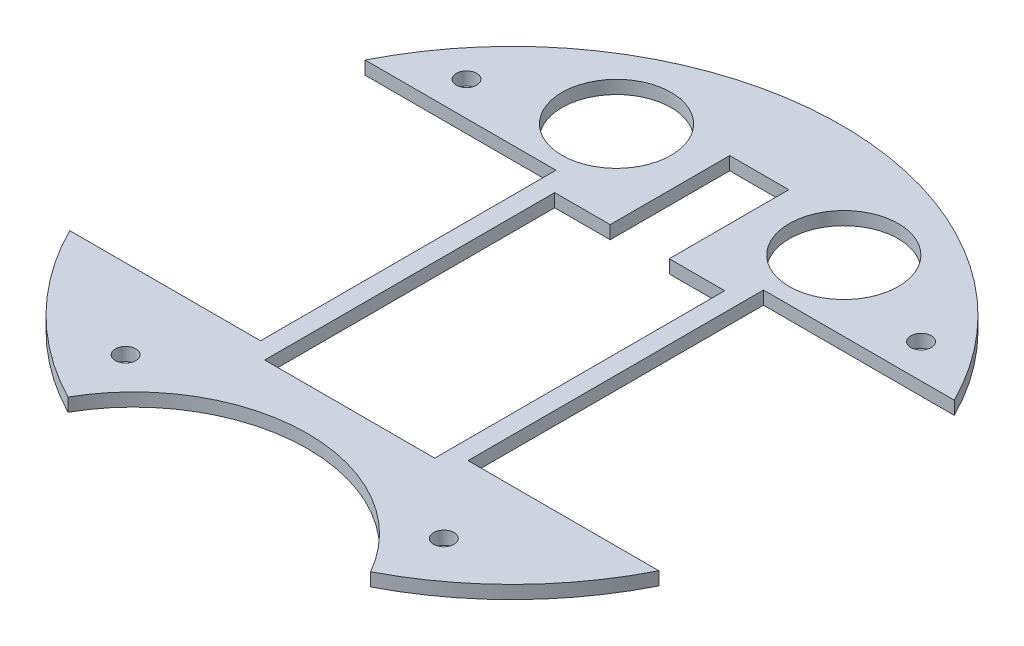
ISO-10303-21;
HEADER;
FILE_DESCRIPTION(('STEP AP214'),'2;1');
FILE_NAME('part.step','',(''),(''),'','','');
FILE_SCHEMA(('AUTOMOTIVE_DESIGN { 1 0 10303 214 1 1 1 1 }'));
ENDSEC;
DATA;
#1=APPLICATION_CONTEXT('core data for automotive mechanical design processes');
#2=APPLICATION_PROTOCOL_DEFINITION('international standard','automotive_design',2000,#1);
#3=PRODUCT_CONTEXT('',#1,'mechanical');
#4=PRODUCT('Part','Part','',(#3));
#5=PRODUCT_RELATED_PRODUCT_CATEGORY('part','',(#4));
#6=PRODUCT_DEFINITION_FORMATION('','',#4);
#7=PRODUCT_DEFINITION_CONTEXT('part definition',#1,'design');
#8=PRODUCT_DEFINITION('design','',#6,#7);
#9=PRODUCT_DEFINITION_SHAPE('','',#8);
#10=(LENGTH_UNIT() NAMED_UNIT(*) SI_UNIT(.MILLI.,.METRE.));
#11=(NAMED_UNIT(*) PLANE_ANGLE_UNIT() SI_UNIT($,.RADIAN.));
#12=(NAMED_UNIT(*) SI_UNIT($,.STERADIAN.) SOLID_ANGLE_UNIT());
#13=UNCERTAINTY_MEASURE_WITH_UNIT(LENGTH_MEASURE(1.E-05),#10,'distance_accuracy_value','');
#14=(GEOMETRIC_REPRESENTATION_CONTEXT(3) GLOBAL_UNCERTAINTY_ASSIGNED_CONTEXT((#13)) GLOBAL_UNIT_ASSIGNED_CONTEXT((#10,
#11,#12)) REPRESENTATION_CONTEXT('',''));
#15=CARTESIAN_POINT('',(0.,0.,0.));
#16=DIRECTION('',(0.,0.,1.));
#17=DIRECTION('',(1.,0.,0.));
#18=AXIS2_PLACEMENT_3D('',#15,#16,#17);
#19=CARTESIAN_POINT('',(18.7,0.,-28.1));
#20=DIRECTION('',(0.,0.,-1.));
#21=DIRECTION('',(-1.,0.,0.));
#22=AXIS2_PLACEMENT_3D('',#19,#20,#21);
#23=PLANE('',#22);
#24=DIRECTION('',(-1.,0.,0.));
#25=VECTOR('',#24,1.);
#26=CARTESIAN_POINT('',(18.7,0.,-28.1));
#27=LINE('',#26,#25);
#28=CARTESIAN_POINT('',(-6.5,0.,-28.1));
#29=VERTEX_POINT('',#28);
#30=CARTESIAN_POINT('',(-18.7,0.,-28.1));
#31=VERTEX_POINT('',#30);
#32=EDGE_CURVE('E174',#29,#31,#27,.T.);
#33=ORIENTED_EDGE('',*,*,#32,.F.);
#34=DIRECTION('',(0.,1.,0.));
#35=VECTOR('',#34,1.);
#36=CARTESIAN_POINT('',(-6.5,0.,-28.1));
#37=LINE('',#36,#35);
#38=CARTESIAN_POINT('',(-6.5,2.9,-28.1));
#39=VERTEX_POINT('',#38);
#40=EDGE_CURVE('E157',#29,#39,#37,.T.);
#41=ORIENTED_EDGE('',*,*,#40,.T.);
#42=DIRECTION('',(-1.,0.,0.));
#43=VECTOR('',#42,1.);
#44=CARTESIAN_POINT('',(18.7,2.9,-28.1));
#45=LINE('',#44,#43);
#46=CARTESIAN_POINT('',(-18.7,2.9,-28.1));
#47=VERTEX_POINT('',#46);
#48=EDGE_CURVE('E201',#39,#47,#45,.T.);
#49=ORIENTED_EDGE('',*,*,#48,.T.);
#50=DIRECTION('',(0.,1.,0.));
#51=VECTOR('',#50,1.);
#52=CARTESIAN_POINT('',(-18.7,0.,-28.1));
#53=LINE('',#52,#51);
#54=EDGE_CURVE('E180',#31,#47,#53,.T.);
#55=ORIENTED_EDGE('',*,*,#54,.F.);
#56=EDGE_LOOP('',(#33,#41,#49,#55));
#57=FACE_BOUND('',#56,.T.);
#58=ADVANCED_FACE('F32',(#57),#23,.F.);
#59=CARTESIAN_POINT('',(0.,2.9,0.));
#60=DIRECTION('',(0.,-1.,0.));
#61=DIRECTION('',(0.,0.,-1.));
#62=AXIS2_PLACEMENT_3D('',#59,#60,#61);
#63=CYLINDRICAL_SURFACE('',#62,72.5);
#64=CARTESIAN_POINT('',(0.,0.,0.));
#65=DIRECTION('',(0.,1.,0.));
#66=DIRECTION('',(0.,0.,1.));
#67=AXIS2_PLACEMENT_3D('',#64,#65,#66);
#68=CIRCLE('',#67,72.5);
#69=CARTESIAN_POINT('',(33.2911053697012,0.,64.4045984636458));
#70=VERTEX_POINT('',#69);
#71=CARTESIAN_POINT('',(64.8074069840786,0.,32.4999999999999));
#72=VERTEX_POINT('',#71);
#73=EDGE_CURVE('E218',#70,#72,#68,.T.);
#74=ORIENTED_EDGE('',*,*,#73,.T.);
#75=DIRECTION('',(0.,1.,0.));
#76=VECTOR('',#75,1.);
#77=CARTESIAN_POINT('',(64.8074069840786,0.,32.4999999999999));
#78=LINE('',#77,#76);
#79=CARTESIAN_POINT('',(64.8074069840786,2.9,32.4999999999999));
#80=VERTEX_POINT('',#79);
#81=EDGE_CURVE('E244',#72,#80,#78,.T.);
#82=ORIENTED_EDGE('',*,*,#81,.T.);
#83=CARTESIAN_POINT('',(0.,2.9,0.));
#84=DIRECTION('',(0.,1.,0.));
#85=DIRECTION('',(0.,0.,1.));
#86=AXIS2_PLACEMENT_3D('',#83,#84,#85);
#87=CIRCLE('',#86,72.5);
#88=CARTESIAN_POINT('',(33.2911053697012,2.9,64.4045984636458));
#89=VERTEX_POINT('',#88);
#90=EDGE_CURVE('E219',#89,#80,#87,.T.);
#91=ORIENTED_EDGE('',*,*,#90,.F.);
#92=DIRECTION('',(0.,-1.,0.));
#93=VECTOR('',#92,1.);
#94=CARTESIAN_POINT('',(33.2911053697012,2.9,64.4045984636458));
#95=LINE('',#94,#93);
#96=EDGE_CURVE('E11',#89,#70,#95,.T.);
#97=ORIENTED_EDGE('',*,*,#96,.T.);
#98=EDGE_LOOP('',(#74,#82,#91,#97));
#99=FACE_BOUND('',#98,.T.);
#100=ADVANCED_FACE('F243',(#99),#63,.T.);
#101=CARTESIAN_POINT('',(64.8074069840786,2.9,-32.5));
#102=VERTEX_POINT('',#101);
#103=CARTESIAN_POINT('',(-64.8074069840786,2.9,-32.5));
#104=VERTEX_POINT('',#103);
#105=EDGE_CURVE('E222',#102,#104,#87,.T.);
#106=ORIENTED_EDGE('',*,*,#105,.F.);
#107=DIRECTION('',(0.,1.,0.));
#108=VECTOR('',#107,1.);
#109=CARTESIAN_POINT('',(64.8074069840786,0.,-32.5));
#110=LINE('',#109,#108);
#111=CARTESIAN_POINT('',(64.8074069840786,0.,-32.5));
#112=VERTEX_POINT('',#111);
#113=EDGE_CURVE('E319',#112,#102,#110,.T.);
#114=ORIENTED_EDGE('',*,*,#113,.F.);
#115=CARTESIAN_POINT('',(-64.8074069840786,0.,-32.5));
#116=VERTEX_POINT('',#115);
#117=EDGE_CURVE('E227',#112,#116,#68,.T.);
#118=ORIENTED_EDGE('',*,*,#117,.T.);
#119=DIRECTION('',(0.,1.,0.));
#120=VECTOR('',#119,1.);
#121=CARTESIAN_POINT('',(-64.8074069840786,0.,-32.5));
#122=LINE('',#121,#120);
#123=EDGE_CURVE('E268',#116,#104,#122,.T.);
#124=ORIENTED_EDGE('',*,*,#123,.T.);
#125=EDGE_LOOP('',(#106,#114,#118,#124));
#126=FACE_BOUND('',#125,.T.);
#127=ADVANCED_FACE('F275',(#126),#63,.T.);
#128=CARTESIAN_POINT('',(0.,2.9,83.2397996376034));
#129=DIRECTION('',(0.,-1.,0.));
#130=DIRECTION('',(0.,0.,-1.));
#131=AXIS2_PLACEMENT_3D('',#128,#129,#130);
#132=CYLINDRICAL_SURFACE('',#131,38.25);
#133=CARTESIAN_POINT('',(0.,0.,83.2397996376034));
#134=DIRECTION('',(0.,-1.,0.));
#135=DIRECTION('',(0.,0.,1.));
#136=AXIS2_PLACEMENT_3D('',#133,#134,#135);
#137=CIRCLE('',#136,38.25);
#138=CARTESIAN_POINT('',(-33.2911053697012,0.,64.4045984636458));
#139=VERTEX_POINT('',#138);
#140=EDGE_CURVE('E207',#139,#70,#137,.T.);
#141=ORIENTED_EDGE('',*,*,#140,.T.);
#142=ORIENTED_EDGE('',*,*,#96,.F.);
#143=CARTESIAN_POINT('',(0.,2.9,83.2397996376034));
#144=DIRECTION('',(0.,-1.,0.));
#145=DIRECTION('',(0.,0.,1.));
#146=AXIS2_PLACEMENT_3D('',#143,#144,#145);
#147=CIRCLE('',#146,38.25);
#148=CARTESIAN_POINT('',(-33.2911053697012,2.9,64.4045984636458));
#149=VERTEX_POINT('',#148);
#150=EDGE_CURVE('E214',#149,#89,#147,.T.);
#151=ORIENTED_EDGE('',*,*,#150,.F.);
#152=DIRECTION('',(0.,-1.,0.));
#153=VECTOR('',#152,1.);
#154=CARTESIAN_POINT('',(-33.2911053697012,2.9,64.4045984636458));
#155=LINE('',#154,#153);
#156=EDGE_CURVE('E40',#149,#139,#155,.T.);
#157=ORIENTED_EDGE('',*,*,#156,.T.);
#158=EDGE_LOOP('',(#141,#142,#151,#157));
#159=FACE_BOUND('',#158,.T.);
#160=ADVANCED_FACE('F34',(#159),#132,.F.);
#161=CARTESIAN_POINT('',(-64.8074069840787,2.9,32.4999999999999));
#162=VERTEX_POINT('',#161);
#163=EDGE_CURVE('E217',#162,#149,#87,.T.);
#164=ORIENTED_EDGE('',*,*,#163,.F.);
#165=DIRECTION('',(0.,1.,0.));
#166=VECTOR('',#165,1.);
#167=CARTESIAN_POINT('',(-64.8074069840787,0.,32.4999999999999));
#168=LINE('',#167,#166);
#169=CARTESIAN_POINT('',(-64.8074069840787,0.,32.4999999999999));
#170=VERTEX_POINT('',#169);
#171=EDGE_CURVE('E195',#170,#162,#168,.T.);
#172=ORIENTED_EDGE('',*,*,#171,.F.);
#173=EDGE_CURVE('E225',#170,#139,#68,.T.);
#174=ORIENTED_EDGE('',*,*,#173,.T.);
#175=ORIENTED_EDGE('',*,*,#156,.F.);
#176=EDGE_LOOP('',(#164,#172,#174,#175));
#177=FACE_BOUND('',#176,.T.);
#178=ADVANCED_FACE('F342',(#177),#63,.T.);
#179=CARTESIAN_POINT('',(0.,2.9,41.6198998188017));
#180=DIRECTION('',(0.,1.,0.));
#181=DIRECTION('',(0.,0.,1.));
#182=AXIS2_PLACEMENT_3D('',#179,#180,#181);
#183=PLANE('',#182);
#184=CARTESIAN_POINT('',(-35.,2.9,50.));
#185=DIRECTION('',(0.,1.,0.));
#186=DIRECTION('',(0.,0.,1.));
#187=AXIS2_PLACEMENT_3D('',#184,#185,#186);
#188=CIRCLE('',#187,2.25);
#189=CARTESIAN_POINT('',(-35.,2.9,52.25));
#190=VERTEX_POINT('',#189);
#191=EDGE_CURVE('E436',#190,#190,#188,.T.);
#192=ORIENTED_EDGE('',*,*,#191,.F.);
#193=EDGE_LOOP('',(#192));
#194=FACE_BOUND('',#193,.T.);
#195=CARTESIAN_POINT('',(-50.,2.9,-40.));
#196=DIRECTION('',(0.,1.,0.));
#197=DIRECTION('',(0.,0.,1.));
#198=AXIS2_PLACEMENT_3D('',#195,#196,#197);
#199=CIRCLE('',#198,2.25);
#200=CARTESIAN_POINT('',(-50.,2.9,-37.75));
#201=VERTEX_POINT('',#200);
#202=EDGE_CURVE('E442',#201,#201,#199,.T.);
#203=ORIENTED_EDGE('',*,*,#202,.F.);
#204=EDGE_LOOP('',(#203));
#205=FACE_BOUND('',#204,.T.);
#206=CARTESIAN_POINT('',(50.,2.9,-40.));
#207=DIRECTION('',(0.,1.,0.));
#208=DIRECTION('',(0.,0.,1.));
#209=AXIS2_PLACEMENT_3D('',#206,#207,#208);
#210=CIRCLE('',#209,2.25);
#211=CARTESIAN_POINT('',(50.,2.9,-37.75));
#212=VERTEX_POINT('',#211);
#213=EDGE_CURVE('E450',#212,#212,#210,.T.);
#214=ORIENTED_EDGE('',*,*,#213,.F.);
#215=EDGE_LOOP('',(#214));
#216=FACE_BOUND('',#215,.T.);
#217=CARTESIAN_POINT('',(35.,2.9,50.));
#218=DIRECTION('',(0.,1.,0.));
#219=DIRECTION('',(0.,0.,1.));
#220=AXIS2_PLACEMENT_3D('',#217,#218,#219);
#221=CIRCLE('',#220,2.25);
#222=CARTESIAN_POINT('',(35.,2.9,52.25));
#223=VERTEX_POINT('',#222);
#224=EDGE_CURVE('E439',#223,#223,#221,.T.);
#225=ORIENTED_EDGE('',*,*,#224,.F.);
#226=EDGE_LOOP('',(#225));
#227=FACE_BOUND('',#226,.T.);
#228=CARTESIAN_POINT('',(25.,2.9,-48.));
#229=DIRECTION('',(0.,1.,0.));
#230=DIRECTION('',(0.,0.,1.));
#231=AXIS2_PLACEMENT_3D('',#228,#229,#230);
#232=CIRCLE('',#231,12.);
#233=CARTESIAN_POINT('',(25.,2.9,-36.));
#234=VERTEX_POINT('',#233);
#235=EDGE_CURVE('E456',#234,#234,#232,.T.);
#236=ORIENTED_EDGE('',*,*,#235,.F.);
#237=EDGE_LOOP('',(#236));
#238=FACE_BOUND('',#237,.T.);
#239=CARTESIAN_POINT('',(-25.,2.9,-48.));
#240=DIRECTION('',(0.,1.,0.));
#241=DIRECTION('',(0.,0.,1.));
#242=AXIS2_PLACEMENT_3D('',#239,#240,#241);
#243=CIRCLE('',#242,12.);
#244=CARTESIAN_POINT('',(-25.,2.9,-36.));
#245=VERTEX_POINT('',#244);
#246=EDGE_CURVE('E462',#245,#245,#243,.T.);
#247=ORIENTED_EDGE('',*,*,#246,.F.);
#248=EDGE_LOOP('',(#247));
#249=FACE_BOUND('',#248,.T.);
#250=DIRECTION('',(0.,0.,1.));
#251=VECTOR('',#250,1.);
#252=CARTESIAN_POINT('',(-6.5,2.9,-28.1));
#253=LINE('',#252,#251);
#254=CARTESIAN_POINT('',(-6.5,2.9,-54.4));
#255=VERTEX_POINT('',#254);
#256=EDGE_CURVE('E163',#255,#39,#253,.T.);
#257=ORIENTED_EDGE('',*,*,#256,.F.);
#258=DIRECTION('',(-1.,0.,0.));
#259=VECTOR('',#258,1.);
#260=CARTESIAN_POINT('',(6.5,2.9,-54.4));
#261=LINE('',#260,#259);
#262=CARTESIAN_POINT('',(6.5,2.9,-54.4));
#263=VERTEX_POINT('',#262);
#264=EDGE_CURVE('E177',#263,#255,#261,.T.);
#265=ORIENTED_EDGE('',*,*,#264,.F.);
#266=DIRECTION('',(0.,0.,-1.));
#267=VECTOR('',#266,1.);
#268=CARTESIAN_POINT('',(6.5,2.9,-28.1));
#269=LINE('',#268,#267);
#270=CARTESIAN_POINT('',(6.5,2.9,-28.1));
#271=VERTEX_POINT('',#270);
#272=EDGE_CURVE('E302',#271,#263,#269,.T.);
#273=ORIENTED_EDGE('',*,*,#272,.F.);
#274=CARTESIAN_POINT('',(18.7,2.9,-28.1));
#275=VERTEX_POINT('',#274);
#276=EDGE_CURVE('E202',#275,#271,#45,.T.);
#277=ORIENTED_EDGE('',*,*,#276,.F.);
#278=DIRECTION('',(0.,0.,-1.));
#279=VECTOR('',#278,1.);
#280=CARTESIAN_POINT('',(18.7,2.9,35.7));
#281=LINE('',#280,#279);
#282=CARTESIAN_POINT('',(18.7,2.9,35.7));
#283=VERTEX_POINT('',#282);
#284=EDGE_CURVE('E198',#283,#275,#281,.T.);
#285=ORIENTED_EDGE('',*,*,#284,.F.);
#286=DIRECTION('',(1.,0.,0.));
#287=VECTOR('',#286,1.);
#288=CARTESIAN_POINT('',(-18.7,2.9,35.7));
#289=LINE('',#288,#287);
#290=CARTESIAN_POINT('',(-18.7,2.9,35.7));
#291=VERTEX_POINT('',#290);
#292=EDGE_CURVE('E194',#291,#283,#289,.T.);
#293=ORIENTED_EDGE('',*,*,#292,.F.);
#294=DIRECTION('',(0.,0.,1.));
#295=VECTOR('',#294,1.);
#296=CARTESIAN_POINT('',(-18.7,2.9,-28.1));
#297=LINE('',#296,#295);
#298=EDGE_CURVE('E192',#47,#291,#297,.T.);
#299=ORIENTED_EDGE('',*,*,#298,.F.);
#300=ORIENTED_EDGE('',*,*,#48,.F.);
#301=EDGE_LOOP('',(#257,#265,#273,#277,#285,#293,#299,#300));
#302=FACE_BOUND('',#301,.T.);
#303=DIRECTION('',(1.,0.,0.));
#304=VECTOR('',#303,1.);
#305=CARTESIAN_POINT('',(34.6299999999999,2.9,32.5));
#306=LINE('',#305,#304);
#307=CARTESIAN_POINT('',(22.8299999999999,2.9,32.4999999999999));
#308=VERTEX_POINT('',#307);
#309=EDGE_CURVE('E316',#308,#80,#306,.T.);
#310=ORIENTED_EDGE('',*,*,#309,.F.);
#311=DIRECTION('',(0.,0.,1.));
#312=VECTOR('',#311,1.);
#313=CARTESIAN_POINT('',(22.8299999999999,2.9,-32.5));
#314=LINE('',#313,#312);
#315=CARTESIAN_POINT('',(22.8299999999999,2.9,-32.5));
#316=VERTEX_POINT('',#315);
#317=EDGE_CURVE('E321',#316,#308,#314,.T.);
#318=ORIENTED_EDGE('',*,*,#317,.F.);
#319=DIRECTION('',(-1.,0.,0.));
#320=VECTOR('',#319,1.);
#321=CARTESIAN_POINT('',(64.8074069840786,2.9,-32.5));
#322=LINE('',#321,#320);
#323=EDGE_CURVE('E260',#102,#316,#322,.T.);
#324=ORIENTED_EDGE('',*,*,#323,.F.);
#325=ORIENTED_EDGE('',*,*,#105,.T.);
#326=DIRECTION('',(-1.,0.,0.));
#327=VECTOR('',#326,1.);
#328=CARTESIAN_POINT('',(-22.8299999999999,2.9,-32.5));
#329=LINE('',#328,#327);
#330=CARTESIAN_POINT('',(-22.8299999999999,2.9,-32.5));
#331=VERTEX_POINT('',#330);
#332=EDGE_CURVE('E257',#331,#104,#329,.T.);
#333=ORIENTED_EDGE('',*,*,#332,.F.);
#334=DIRECTION('',(0.,0.,-1.));
#335=VECTOR('',#334,1.);
#336=CARTESIAN_POINT('',(-22.8299999999999,2.9,32.4999999999999));
#337=LINE('',#336,#335);
#338=CARTESIAN_POINT('',(-22.8299999999999,2.9,32.4999999999999));
#339=VERTEX_POINT('',#338);
#340=EDGE_CURVE('E273',#339,#331,#337,.T.);
#341=ORIENTED_EDGE('',*,*,#340,.F.);
#342=DIRECTION('',(1.,0.,0.));
#343=VECTOR('',#342,1.);
#344=CARTESIAN_POINT('',(-34.6299999999999,2.9,32.5));
#345=LINE('',#344,#343);
#346=EDGE_CURVE('E251',#162,#339,#345,.T.);
#347=ORIENTED_EDGE('',*,*,#346,.F.);
#348=ORIENTED_EDGE('',*,*,#163,.T.);
#349=ORIENTED_EDGE('',*,*,#150,.T.);
#350=ORIENTED_EDGE('',*,*,#90,.T.);
#351=EDGE_LOOP('',(#310,#318,#324,#325,#333,#341,#347,#348,#349,#350));
#352=FACE_BOUND('',#351,.T.);
#353=ADVANCED_FACE('F247',(#194,#205,#216,#227,#238,#249,#302,#352),#183,.T.);
#354=CARTESIAN_POINT('',(0.,0.,41.6198998188017));
#355=DIRECTION('',(0.,1.,0.));
#356=DIRECTION('',(0.,0.,1.));
#357=AXIS2_PLACEMENT_3D('',#354,#355,#356);
#358=PLANE('',#357);
#359=CARTESIAN_POINT('',(-35.,0.,50.));
#360=DIRECTION('',(0.,1.,0.));
#361=DIRECTION('',(0.,0.,1.));
#362=AXIS2_PLACEMENT_3D('',#359,#360,#361);
#363=CIRCLE('',#362,2.25);
#364=CARTESIAN_POINT('',(-35.,0.,52.25));
#365=VERTEX_POINT('',#364);
#366=EDGE_CURVE('E433',#365,#365,#363,.T.);
#367=ORIENTED_EDGE('',*,*,#366,.T.);
#368=EDGE_LOOP('',(#367));
#369=FACE_BOUND('',#368,.T.);
#370=CARTESIAN_POINT('',(-50.,0.,-40.));
#371=DIRECTION('',(0.,1.,0.));
#372=DIRECTION('',(0.,0.,1.));
#373=AXIS2_PLACEMENT_3D('',#370,#371,#372);
#374=CIRCLE('',#373,2.25);
#375=CARTESIAN_POINT('',(-50.,0.,-37.75));
#376=VERTEX_POINT('',#375);
#377=EDGE_CURVE('E437',#376,#376,#374,.T.);
#378=ORIENTED_EDGE('',*,*,#377,.T.);
#379=EDGE_LOOP('',(#378));
#380=FACE_BOUND('',#379,.T.);
#381=CARTESIAN_POINT('',(50.,0.,-40.));
#382=DIRECTION('',(0.,1.,0.));
#383=DIRECTION('',(0.,0.,1.));
#384=AXIS2_PLACEMENT_3D('',#381,#382,#383);
#385=CIRCLE('',#384,2.25);
#386=CARTESIAN_POINT('',(50.,0.,-37.75));
#387=VERTEX_POINT('',#386);
#388=EDGE_CURVE('E447',#387,#387,#385,.T.);
#389=ORIENTED_EDGE('',*,*,#388,.T.);
#390=EDGE_LOOP('',(#389));
#391=FACE_BOUND('',#390,.T.);
#392=CARTESIAN_POINT('',(35.,0.,50.));
#393=DIRECTION('',(0.,1.,0.));
#394=DIRECTION('',(0.,0.,1.));
#395=AXIS2_PLACEMENT_3D('',#392,#393,#394);
#396=CIRCLE('',#395,2.25);
#397=CARTESIAN_POINT('',(35.,0.,52.25));
#398=VERTEX_POINT('',#397);
#399=EDGE_CURVE('E453',#398,#398,#396,.T.);
#400=ORIENTED_EDGE('',*,*,#399,.T.);
#401=EDGE_LOOP('',(#400));
#402=FACE_BOUND('',#401,.T.);
#403=CARTESIAN_POINT('',(25.,0.,-48.));
#404=DIRECTION('',(0.,1.,0.));
#405=DIRECTION('',(0.,0.,1.));
#406=AXIS2_PLACEMENT_3D('',#403,#404,#405);
#407=CIRCLE('',#406,12.);
#408=CARTESIAN_POINT('',(25.,0.,-36.));
#409=VERTEX_POINT('',#408);
#410=EDGE_CURVE('E459',#409,#409,#407,.T.);
#411=ORIENTED_EDGE('',*,*,#410,.T.);
#412=EDGE_LOOP('',(#411));
#413=FACE_BOUND('',#412,.T.);
#414=CARTESIAN_POINT('',(-25.,0.,-48.));
#415=DIRECTION('',(0.,1.,0.));
#416=DIRECTION('',(0.,0.,1.));
#417=AXIS2_PLACEMENT_3D('',#414,#415,#416);
#418=CIRCLE('',#417,12.);
#419=CARTESIAN_POINT('',(-25.,0.,-36.));
#420=VERTEX_POINT('',#419);
#421=EDGE_CURVE('E303',#420,#420,#418,.T.);
#422=ORIENTED_EDGE('',*,*,#421,.T.);
#423=EDGE_LOOP('',(#422));
#424=FACE_BOUND('',#423,.T.);
#425=DIRECTION('',(-1.,0.,0.));
#426=VECTOR('',#425,1.);
#427=CARTESIAN_POINT('',(6.5,0.,-54.4));
#428=LINE('',#427,#426);
#429=CARTESIAN_POINT('',(6.5,0.,-54.4));
#430=VERTEX_POINT('',#429);
#431=CARTESIAN_POINT('',(-6.5,0.,-54.4));
#432=VERTEX_POINT('',#431);
#433=EDGE_CURVE('E168',#430,#432,#428,.T.);
#434=ORIENTED_EDGE('',*,*,#433,.T.);
#435=DIRECTION('',(0.,0.,1.));
#436=VECTOR('',#435,1.);
#437=CARTESIAN_POINT('',(-6.5,0.,-28.1));
#438=LINE('',#437,#436);
#439=EDGE_CURVE('E160',#432,#29,#438,.T.);
#440=ORIENTED_EDGE('',*,*,#439,.T.);
#441=ORIENTED_EDGE('',*,*,#32,.T.);
#442=DIRECTION('',(0.,0.,1.));
#443=VECTOR('',#442,1.);
#444=CARTESIAN_POINT('',(-18.7,0.,-28.1));
#445=LINE('',#444,#443);
#446=CARTESIAN_POINT('',(-18.7,0.,35.7));
#447=VERTEX_POINT('',#446);
#448=EDGE_CURVE('E205',#31,#447,#445,.T.);
#449=ORIENTED_EDGE('',*,*,#448,.T.);
#450=DIRECTION('',(1.,0.,0.));
#451=VECTOR('',#450,1.);
#452=CARTESIAN_POINT('',(-18.7,0.,35.7));
#453=LINE('',#452,#451);
#454=CARTESIAN_POINT('',(18.7,0.,35.7));
#455=VERTEX_POINT('',#454);
#456=EDGE_CURVE('E188',#447,#455,#453,.T.);
#457=ORIENTED_EDGE('',*,*,#456,.T.);
#458=DIRECTION('',(0.,0.,-1.));
#459=VECTOR('',#458,1.);
#460=CARTESIAN_POINT('',(18.7,0.,35.7));
#461=LINE('',#460,#459);
#462=CARTESIAN_POINT('',(18.7,0.,-28.1));
#463=VERTEX_POINT('',#462);
#464=EDGE_CURVE('E183',#455,#463,#461,.T.);
#465=ORIENTED_EDGE('',*,*,#464,.T.);
#466=CARTESIAN_POINT('',(6.5,0.,-28.1));
#467=VERTEX_POINT('',#466);
#468=EDGE_CURVE('E182',#463,#467,#27,.T.);
#469=ORIENTED_EDGE('',*,*,#468,.T.);
#470=DIRECTION('',(0.,0.,-1.));
#471=VECTOR('',#470,1.);
#472=CARTESIAN_POINT('',(6.5,0.,-28.1));
#473=LINE('',#472,#471);
#474=EDGE_CURVE('E47',#467,#430,#473,.T.);
#475=ORIENTED_EDGE('',*,*,#474,.T.);
#476=EDGE_LOOP('',(#434,#440,#441,#449,#457,#465,#469,#475));
#477=FACE_BOUND('',#476,.T.);
#478=DIRECTION('',(0.,0.,1.));
#479=VECTOR('',#478,1.);
#480=CARTESIAN_POINT('',(22.8299999999999,0.,-32.5));
#481=LINE('',#480,#479);
#482=CARTESIAN_POINT('',(22.8299999999999,0.,-32.5));
#483=VERTEX_POINT('',#482);
#484=CARTESIAN_POINT('',(22.8299999999999,0.,32.4999999999999));
#485=VERTEX_POINT('',#484);
#486=EDGE_CURVE('E55',#483,#485,#481,.T.);
#487=ORIENTED_EDGE('',*,*,#486,.T.);
#488=DIRECTION('',(1.,0.,0.));
#489=VECTOR('',#488,1.);
#490=CARTESIAN_POINT('',(22.8299999999999,0.,32.4999999999999));
#491=LINE('',#490,#489);
#492=EDGE_CURVE('E240',#485,#72,#491,.T.);
#493=ORIENTED_EDGE('',*,*,#492,.T.);
#494=ORIENTED_EDGE('',*,*,#73,.F.);
#495=ORIENTED_EDGE('',*,*,#140,.F.);
#496=ORIENTED_EDGE('',*,*,#173,.F.);
#497=DIRECTION('',(1.,0.,0.));
#498=VECTOR('',#497,1.);
#499=CARTESIAN_POINT('',(-64.8074069840786,0.,32.4999999999999));
#500=LINE('',#499,#498);
#501=CARTESIAN_POINT('',(-22.8299999999999,0.,32.4999999999999));
#502=VERTEX_POINT('',#501);
#503=EDGE_CURVE('E272',#170,#502,#500,.T.);
#504=ORIENTED_EDGE('',*,*,#503,.T.);
#505=DIRECTION('',(0.,0.,-1.));
#506=VECTOR('',#505,1.);
#507=CARTESIAN_POINT('',(-22.8299999999999,0.,32.4999999999999));
#508=LINE('',#507,#506);
#509=CARTESIAN_POINT('',(-22.8299999999999,0.,-32.5));
#510=VERTEX_POINT('',#509);
#511=EDGE_CURVE('E332',#502,#510,#508,.T.);
#512=ORIENTED_EDGE('',*,*,#511,.T.);
#513=DIRECTION('',(-1.,0.,0.));
#514=VECTOR('',#513,1.);
#515=CARTESIAN_POINT('',(-22.8299999999999,0.,-32.5));
#516=LINE('',#515,#514);
#517=EDGE_CURVE('E283',#510,#116,#516,.T.);
#518=ORIENTED_EDGE('',*,*,#517,.T.);
#519=ORIENTED_EDGE('',*,*,#117,.F.);
#520=DIRECTION('',(-1.,0.,0.));
#521=VECTOR('',#520,1.);
#522=CARTESIAN_POINT('',(64.8074069840786,0.,-32.5));
#523=LINE('',#522,#521);
#524=EDGE_CURVE('E313',#112,#483,#523,.T.);
#525=ORIENTED_EDGE('',*,*,#524,.T.);
#526=EDGE_LOOP('',(#487,#493,#494,#495,#496,#504,#512,#518,#519,#525));
#527=FACE_BOUND('',#526,.T.);
#528=ADVANCED_FACE('F171',(#369,#380,#391,#402,#413,#424,#477,#527),#358,.F.);
#529=CARTESIAN_POINT('',(-18.7,0.,-28.1));
#530=DIRECTION('',(-1.,0.,0.));
#531=DIRECTION('',(0.,0.,1.));
#532=AXIS2_PLACEMENT_3D('',#529,#530,#531);
#533=PLANE('',#532);
#534=ORIENTED_EDGE('',*,*,#298,.T.);
#535=DIRECTION('',(0.,1.,0.));
#536=VECTOR('',#535,1.);
#537=CARTESIAN_POINT('',(-18.7,0.,35.7));
#538=LINE('',#537,#536);
#539=EDGE_CURVE('E186',#447,#291,#538,.T.);
#540=ORIENTED_EDGE('',*,*,#539,.F.);
#541=ORIENTED_EDGE('',*,*,#448,.F.);
#542=ORIENTED_EDGE('',*,*,#54,.T.);
#543=EDGE_LOOP('',(#534,#540,#541,#542));
#544=FACE_BOUND('',#543,.T.);
#545=ADVANCED_FACE('F360',(#544),#533,.F.);
#546=ORIENTED_EDGE('',*,*,#276,.T.);
#547=DIRECTION('',(0.,1.,0.));
#548=VECTOR('',#547,1.);
#549=CARTESIAN_POINT('',(6.5,0.,-28.1));
#550=LINE('',#549,#548);
#551=EDGE_CURVE('E167',#467,#271,#550,.T.);
#552=ORIENTED_EDGE('',*,*,#551,.F.);
#553=ORIENTED_EDGE('',*,*,#468,.F.);
#554=DIRECTION('',(0.,1.,0.));
#555=VECTOR('',#554,1.);
#556=CARTESIAN_POINT('',(18.7,0.,-28.1));
#557=LINE('',#556,#555);
#558=EDGE_CURVE('E208',#463,#275,#557,.T.);
#559=ORIENTED_EDGE('',*,*,#558,.T.);
#560=EDGE_LOOP('',(#546,#552,#553,#559));
#561=FACE_BOUND('',#560,.T.);
#562=ADVANCED_FACE('F296',(#561),#23,.F.);
#563=CARTESIAN_POINT('',(18.7,0.,35.7));
#564=DIRECTION('',(1.,0.,0.));
#565=DIRECTION('',(0.,0.,-1.));
#566=AXIS2_PLACEMENT_3D('',#563,#564,#565);
#567=PLANE('',#566);
#568=ORIENTED_EDGE('',*,*,#284,.T.);
#569=ORIENTED_EDGE('',*,*,#558,.F.);
#570=ORIENTED_EDGE('',*,*,#464,.F.);
#571=DIRECTION('',(0.,1.,0.));
#572=VECTOR('',#571,1.);
#573=CARTESIAN_POINT('',(18.7,0.,35.7));
#574=LINE('',#573,#572);
#575=EDGE_CURVE('E210',#455,#283,#574,.T.);
#576=ORIENTED_EDGE('',*,*,#575,.T.);
#577=EDGE_LOOP('',(#568,#569,#570,#576));
#578=FACE_BOUND('',#577,.T.);
#579=ADVANCED_FACE('F292',(#578),#567,.F.);
#580=CARTESIAN_POINT('',(-18.7,0.,35.7));
#581=DIRECTION('',(0.,0.,1.));
#582=DIRECTION('',(1.,0.,0.));
#583=AXIS2_PLACEMENT_3D('',#580,#581,#582);
#584=PLANE('',#583);
#585=ORIENTED_EDGE('',*,*,#292,.T.);
#586=ORIENTED_EDGE('',*,*,#575,.F.);
#587=ORIENTED_EDGE('',*,*,#456,.F.);
#588=ORIENTED_EDGE('',*,*,#539,.T.);
#589=EDGE_LOOP('',(#585,#586,#587,#588));
#590=FACE_BOUND('',#589,.T.);
#591=ADVANCED_FACE('F288',(#590),#584,.F.);
#592=CARTESIAN_POINT('',(-22.8299999999999,0.,-32.5));
#593=DIRECTION('',(0.,0.,-1.));
#594=DIRECTION('',(-1.,0.,0.));
#595=AXIS2_PLACEMENT_3D('',#592,#593,#594);
#596=PLANE('',#595);
#597=ORIENTED_EDGE('',*,*,#332,.T.);
#598=ORIENTED_EDGE('',*,*,#123,.F.);
#599=ORIENTED_EDGE('',*,*,#517,.F.);
#600=DIRECTION('',(0.,1.,0.));
#601=VECTOR('',#600,1.);
#602=CARTESIAN_POINT('',(-22.8299999999999,0.,-32.5));
#603=LINE('',#602,#601);
#604=EDGE_CURVE('E270',#510,#331,#603,.T.);
#605=ORIENTED_EDGE('',*,*,#604,.T.);
#606=EDGE_LOOP('',(#597,#598,#599,#605));
#607=FACE_BOUND('',#606,.T.);
#608=ADVANCED_FACE('F266',(#607),#596,.F.);
#609=CARTESIAN_POINT('',(-22.8299999999999,0.,32.4999999999999));
#610=DIRECTION('',(1.,0.,0.));
#611=DIRECTION('',(0.,0.,-1.));
#612=AXIS2_PLACEMENT_3D('',#609,#610,#611);
#613=PLANE('',#612);
#614=ORIENTED_EDGE('',*,*,#340,.T.);
#615=ORIENTED_EDGE('',*,*,#604,.F.);
#616=ORIENTED_EDGE('',*,*,#511,.F.);
#617=DIRECTION('',(0.,1.,0.));
#618=VECTOR('',#617,1.);
#619=CARTESIAN_POINT('',(-22.8299999999999,0.,32.4999999999999));
#620=LINE('',#619,#618);
#621=EDGE_CURVE('E279',#502,#339,#620,.T.);
#622=ORIENTED_EDGE('',*,*,#621,.T.);
#623=EDGE_LOOP('',(#614,#615,#616,#622));
#624=FACE_BOUND('',#623,.T.);
#625=ADVANCED_FACE('F338',(#624),#613,.F.);
#626=CARTESIAN_POINT('',(-34.6299999999999,0.,32.5));
#627=DIRECTION('',(0.,0.,1.));
#628=DIRECTION('',(1.,0.,0.));
#629=AXIS2_PLACEMENT_3D('',#626,#627,#628);
#630=PLANE('',#629);
#631=ORIENTED_EDGE('',*,*,#346,.T.);
#632=ORIENTED_EDGE('',*,*,#621,.F.);
#633=ORIENTED_EDGE('',*,*,#503,.F.);
#634=ORIENTED_EDGE('',*,*,#171,.T.);
#635=EDGE_LOOP('',(#631,#632,#633,#634));
#636=FACE_BOUND('',#635,.T.);
#637=ADVANCED_FACE('F341',(#636),#630,.F.);
#638=CARTESIAN_POINT('',(34.6299999999999,0.,32.5));
#639=DIRECTION('',(0.,0.,1.));
#640=DIRECTION('',(1.,0.,0.));
#641=AXIS2_PLACEMENT_3D('',#638,#639,#640);
#642=PLANE('',#641);
#643=ORIENTED_EDGE('',*,*,#309,.T.);
#644=ORIENTED_EDGE('',*,*,#81,.F.);
#645=ORIENTED_EDGE('',*,*,#492,.F.);
#646=DIRECTION('',(0.,1.,0.));
#647=VECTOR('',#646,1.);
#648=CARTESIAN_POINT('',(22.8299999999999,0.,32.4999999999999));
#649=LINE('',#648,#647);
#650=EDGE_CURVE('E326',#485,#308,#649,.T.);
#651=ORIENTED_EDGE('',*,*,#650,.T.);
#652=EDGE_LOOP('',(#643,#644,#645,#651));
#653=FACE_BOUND('',#652,.T.);
#654=ADVANCED_FACE('F385',(#653),#642,.F.);
#655=CARTESIAN_POINT('',(22.8299999999999,0.,-32.5));
#656=DIRECTION('',(-1.,0.,0.));
#657=DIRECTION('',(0.,0.,1.));
#658=AXIS2_PLACEMENT_3D('',#655,#656,#657);
#659=PLANE('',#658);
#660=ORIENTED_EDGE('',*,*,#317,.T.);
#661=ORIENTED_EDGE('',*,*,#650,.F.);
#662=ORIENTED_EDGE('',*,*,#486,.F.);
#663=DIRECTION('',(0.,1.,0.));
#664=VECTOR('',#663,1.);
#665=CARTESIAN_POINT('',(22.8299999999999,0.,-32.5));
#666=LINE('',#665,#664);
#667=EDGE_CURVE('E328',#483,#316,#666,.T.);
#668=ORIENTED_EDGE('',*,*,#667,.T.);
#669=EDGE_LOOP('',(#660,#661,#662,#668));
#670=FACE_BOUND('',#669,.T.);
#671=ADVANCED_FACE('F389',(#670),#659,.F.);
#672=CARTESIAN_POINT('',(64.8074069840786,0.,-32.5));
#673=DIRECTION('',(0.,0.,-1.));
#674=DIRECTION('',(-1.,0.,0.));
#675=AXIS2_PLACEMENT_3D('',#672,#673,#674);
#676=PLANE('',#675);
#677=ORIENTED_EDGE('',*,*,#323,.T.);
#678=ORIENTED_EDGE('',*,*,#667,.F.);
#679=ORIENTED_EDGE('',*,*,#524,.F.);
#680=ORIENTED_EDGE('',*,*,#113,.T.);
#681=EDGE_LOOP('',(#677,#678,#679,#680));
#682=FACE_BOUND('',#681,.T.);
#683=ADVANCED_FACE('F382',(#682),#676,.F.);
#684=CARTESIAN_POINT('',(-6.5,0.,-28.1));
#685=DIRECTION('',(-1.,0.,0.));
#686=DIRECTION('',(0.,0.,1.));
#687=AXIS2_PLACEMENT_3D('',#684,#685,#686);
#688=PLANE('',#687);
#689=ORIENTED_EDGE('',*,*,#256,.T.);
#690=ORIENTED_EDGE('',*,*,#40,.F.);
#691=ORIENTED_EDGE('',*,*,#439,.F.);
#692=DIRECTION('',(0.,1.,0.));
#693=VECTOR('',#692,1.);
#694=CARTESIAN_POINT('',(-6.5,0.,-54.4));
#695=LINE('',#694,#693);
#696=EDGE_CURVE('E308',#432,#255,#695,.T.);
#697=ORIENTED_EDGE('',*,*,#696,.T.);
#698=EDGE_LOOP('',(#689,#690,#691,#697));
#699=FACE_BOUND('',#698,.T.);
#700=ADVANCED_FACE('F159',(#699),#688,.F.);
#701=CARTESIAN_POINT('',(6.5,0.,-54.4));
#702=DIRECTION('',(0.,0.,-1.));
#703=DIRECTION('',(-1.,0.,0.));
#704=AXIS2_PLACEMENT_3D('',#701,#702,#703);
#705=PLANE('',#704);
#706=ORIENTED_EDGE('',*,*,#264,.T.);
#707=ORIENTED_EDGE('',*,*,#696,.F.);
#708=ORIENTED_EDGE('',*,*,#433,.F.);
#709=DIRECTION('',(0.,1.,0.));
#710=VECTOR('',#709,1.);
#711=CARTESIAN_POINT('',(6.5,0.,-54.4));
#712=LINE('',#711,#710);
#713=EDGE_CURVE('E310',#430,#263,#712,.T.);
#714=ORIENTED_EDGE('',*,*,#713,.T.);
#715=EDGE_LOOP('',(#706,#707,#708,#714));
#716=FACE_BOUND('',#715,.T.);
#717=ADVANCED_FACE('F398',(#716),#705,.F.);
#718=CARTESIAN_POINT('',(6.5,0.,-28.1));
#719=DIRECTION('',(1.,0.,0.));
#720=DIRECTION('',(0.,0.,-1.));
#721=AXIS2_PLACEMENT_3D('',#718,#719,#720);
#722=PLANE('',#721);
#723=ORIENTED_EDGE('',*,*,#272,.T.);
#724=ORIENTED_EDGE('',*,*,#713,.F.);
#725=ORIENTED_EDGE('',*,*,#474,.F.);
#726=ORIENTED_EDGE('',*,*,#551,.T.);
#727=EDGE_LOOP('',(#723,#724,#725,#726));
#728=FACE_BOUND('',#727,.T.);
#729=ADVANCED_FACE('F399',(#728),#722,.F.);
#730=CARTESIAN_POINT('',(-25.,0.,-48.));
#731=DIRECTION('',(0.,1.,0.));
#732=DIRECTION('',(0.,0.,1.));
#733=AXIS2_PLACEMENT_3D('',#730,#731,#732);
#734=CYLINDRICAL_SURFACE('',#733,12.);
#735=ORIENTED_EDGE('',*,*,#421,.F.);
#736=EDGE_LOOP('',(#735));
#737=FACE_BOUND('',#736,.T.);
#738=ORIENTED_EDGE('',*,*,#246,.T.);
#739=EDGE_LOOP('',(#738));
#740=FACE_BOUND('',#739,.T.);
#741=ADVANCED_FACE('F402',(#737,#740),#734,.F.);
#742=CARTESIAN_POINT('',(25.,0.,-48.));
#743=DIRECTION('',(0.,1.,0.));
#744=DIRECTION('',(0.,0.,1.));
#745=AXIS2_PLACEMENT_3D('',#742,#743,#744);
#746=CYLINDRICAL_SURFACE('',#745,12.);
#747=ORIENTED_EDGE('',*,*,#410,.F.);
#748=EDGE_LOOP('',(#747));
#749=FACE_BOUND('',#748,.T.);
#750=ORIENTED_EDGE('',*,*,#235,.T.);
#751=EDGE_LOOP('',(#750));
#752=FACE_BOUND('',#751,.T.);
#753=ADVANCED_FACE('F408',(#749,#752),#746,.F.);
#754=CARTESIAN_POINT('',(35.,0.,50.));
#755=DIRECTION('',(0.,1.,0.));
#756=DIRECTION('',(0.,0.,1.));
#757=AXIS2_PLACEMENT_3D('',#754,#755,#756);
#758=CYLINDRICAL_SURFACE('',#757,2.25);
#759=ORIENTED_EDGE('',*,*,#399,.F.);
#760=EDGE_LOOP('',(#759));
#761=FACE_BOUND('',#760,.T.);
#762=ORIENTED_EDGE('',*,*,#224,.T.);
#763=EDGE_LOOP('',(#762));
#764=FACE_BOUND('',#763,.T.);
#765=ADVANCED_FACE('F412',(#761,#764),#758,.F.);
#766=CARTESIAN_POINT('',(50.,0.,-40.));
#767=DIRECTION('',(0.,1.,0.));
#768=DIRECTION('',(0.,0.,1.));
#769=AXIS2_PLACEMENT_3D('',#766,#767,#768);
#770=CYLINDRICAL_SURFACE('',#769,2.25);
#771=ORIENTED_EDGE('',*,*,#388,.F.);
#772=EDGE_LOOP('',(#771));
#773=FACE_BOUND('',#772,.T.);
#774=ORIENTED_EDGE('',*,*,#213,.T.);
#775=EDGE_LOOP('',(#774));
#776=FACE_BOUND('',#775,.T.);
#777=ADVANCED_FACE('F416',(#773,#776),#770,.F.);
#778=CARTESIAN_POINT('',(-50.,0.,-40.));
#779=DIRECTION('',(0.,1.,0.));
#780=DIRECTION('',(0.,0.,1.));
#781=AXIS2_PLACEMENT_3D('',#778,#779,#780);
#782=CYLINDRICAL_SURFACE('',#781,2.25);
#783=ORIENTED_EDGE('',*,*,#377,.F.);
#784=EDGE_LOOP('',(#783));
#785=FACE_BOUND('',#784,.T.);
#786=ORIENTED_EDGE('',*,*,#202,.T.);
#787=EDGE_LOOP('',(#786));
#788=FACE_BOUND('',#787,.T.);
#789=ADVANCED_FACE('F420',(#785,#788),#782,.F.);
#790=CARTESIAN_POINT('',(-35.,0.,50.));
#791=DIRECTION('',(0.,1.,0.));
#792=DIRECTION('',(0.,0.,1.));
#793=AXIS2_PLACEMENT_3D('',#790,#791,#792);
#794=CYLINDRICAL_SURFACE('',#793,2.25);
#795=ORIENTED_EDGE('',*,*,#366,.F.);
#796=EDGE_LOOP('',(#795));
#797=FACE_BOUND('',#796,.T.);
#798=ORIENTED_EDGE('',*,*,#191,.T.);
#799=EDGE_LOOP('',(#798));
#800=FACE_BOUND('',#799,.T.);
#801=ADVANCED_FACE('F424',(#797,#800),#794,.F.);
#802=CLOSED_SHELL('',(#58,#100,#127,#160,#178,#353,#528,#545,#562,#579,#591,#608,#625,#637,#654,
#671,#683,#700,#717,#729,#741,#753,#765,#777,#789,#801));
#803=MANIFOLD_SOLID_BREP('B2',#802);
#804=ADVANCED_BREP_SHAPE_REPRESENTATION('',(#18,#803),#14);
#805=SHAPE_DEFINITION_REPRESENTATION(#9,#804);
ENDSEC;
END-ISO-10303-21;
